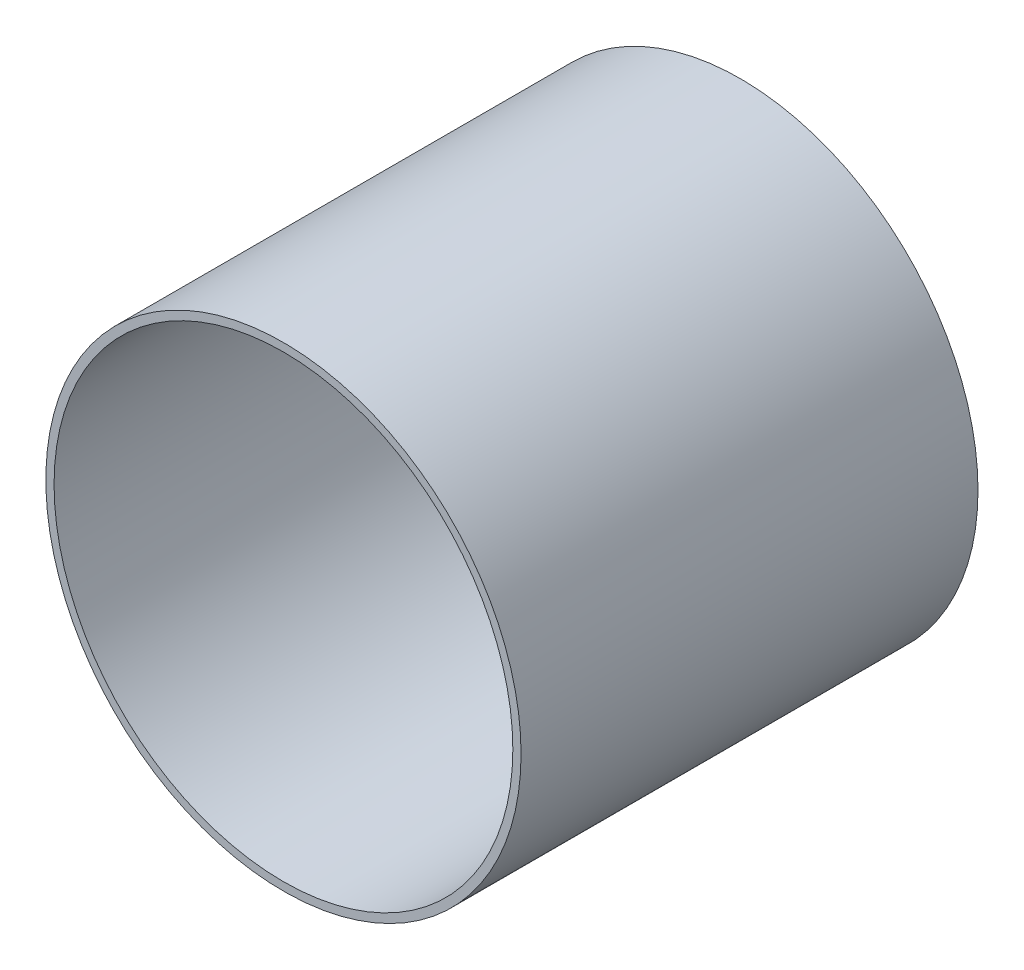
ISO-10303-21;
HEADER;
FILE_DESCRIPTION(('STEP AP214'),'2;1');
FILE_NAME('part.step','',(''),(''),'','','');
FILE_SCHEMA(('AUTOMOTIVE_DESIGN { 1 0 10303 214 1 1 1 1 }'));
ENDSEC;
DATA;
#1=APPLICATION_CONTEXT('core data for automotive mechanical design processes');
#2=APPLICATION_PROTOCOL_DEFINITION('international standard','automotive_design',2000,#1);
#3=PRODUCT_CONTEXT('',#1,'mechanical');
#4=PRODUCT('Part','Part','',(#3));
#5=PRODUCT_RELATED_PRODUCT_CATEGORY('part','',(#4));
#6=PRODUCT_DEFINITION_FORMATION('','',#4);
#7=PRODUCT_DEFINITION_CONTEXT('part definition',#1,'design');
#8=PRODUCT_DEFINITION('design','',#6,#7);
#9=PRODUCT_DEFINITION_SHAPE('','',#8);
#10=(LENGTH_UNIT() NAMED_UNIT(*) SI_UNIT(.MILLI.,.METRE.));
#11=(NAMED_UNIT(*) PLANE_ANGLE_UNIT() SI_UNIT($,.RADIAN.));
#12=(NAMED_UNIT(*) SI_UNIT($,.STERADIAN.) SOLID_ANGLE_UNIT());
#13=UNCERTAINTY_MEASURE_WITH_UNIT(LENGTH_MEASURE(1.E-05),#10,'distance_accuracy_value','');
#14=(GEOMETRIC_REPRESENTATION_CONTEXT(3) GLOBAL_UNCERTAINTY_ASSIGNED_CONTEXT((#13)) GLOBAL_UNIT_ASSIGNED_CONTEXT((#10,
#11,#12)) REPRESENTATION_CONTEXT('',''));
#15=CARTESIAN_POINT('',(0.,0.,0.));
#16=DIRECTION('',(0.,0.,1.));
#17=DIRECTION('',(1.,0.,0.));
#18=AXIS2_PLACEMENT_3D('',#15,#16,#17);
#19=CARTESIAN_POINT('',(0.,0.,25.));
#20=DIRECTION('',(0.,0.,1.));
#21=DIRECTION('',(1.,0.,0.));
#22=AXIS2_PLACEMENT_3D('',#19,#20,#21);
#23=PLANE('',#22);
#24=CARTESIAN_POINT('',(0.,0.,25.));
#25=DIRECTION('',(0.,0.,1.));
#26=DIRECTION('',(1.,0.,0.));
#27=AXIS2_PLACEMENT_3D('',#24,#25,#26);
#28=CIRCLE('',#27,13.);
#29=CARTESIAN_POINT('',(13.,0.,25.));
#30=VERTEX_POINT('',#29);
#31=EDGE_CURVE('E10',#30,#30,#28,.T.);
#32=ORIENTED_EDGE('',*,*,#31,.T.);
#33=EDGE_LOOP('',(#32));
#34=FACE_BOUND('',#33,.T.);
#35=CARTESIAN_POINT('',(0.,0.,25.));
#36=DIRECTION('',(0.,0.,1.));
#37=DIRECTION('',(1.,0.,0.));
#38=AXIS2_PLACEMENT_3D('',#35,#36,#37);
#39=CIRCLE('',#38,12.55);
#40=CARTESIAN_POINT('',(12.55,0.,25.));
#41=VERTEX_POINT('',#40);
#42=EDGE_CURVE('E42',#41,#41,#39,.T.);
#43=ORIENTED_EDGE('',*,*,#42,.F.);
#44=EDGE_LOOP('',(#43));
#45=FACE_BOUND('',#44,.T.);
#46=ADVANCED_FACE('F31',(#34,#45),#23,.T.);
#47=CARTESIAN_POINT('',(0.,0.,0.));
#48=DIRECTION('',(0.,0.,1.));
#49=DIRECTION('',(1.,0.,0.));
#50=AXIS2_PLACEMENT_3D('',#47,#48,#49);
#51=PLANE('',#50);
#52=CARTESIAN_POINT('',(0.,0.,0.));
#53=DIRECTION('',(0.,0.,1.));
#54=DIRECTION('',(1.,0.,0.));
#55=AXIS2_PLACEMENT_3D('',#52,#53,#54);
#56=CIRCLE('',#55,13.);
#57=CARTESIAN_POINT('',(13.,0.,0.));
#58=VERTEX_POINT('',#57);
#59=EDGE_CURVE('E35',#58,#58,#56,.T.);
#60=ORIENTED_EDGE('',*,*,#59,.F.);
#61=EDGE_LOOP('',(#60));
#62=FACE_BOUND('',#61,.T.);
#63=CARTESIAN_POINT('',(0.,0.,0.));
#64=DIRECTION('',(0.,0.,1.));
#65=DIRECTION('',(1.,0.,0.));
#66=AXIS2_PLACEMENT_3D('',#63,#64,#65);
#67=CIRCLE('',#66,12.55);
#68=CARTESIAN_POINT('',(12.55,0.,0.));
#69=VERTEX_POINT('',#68);
#70=EDGE_CURVE('E44',#69,#69,#67,.T.);
#71=ORIENTED_EDGE('',*,*,#70,.T.);
#72=EDGE_LOOP('',(#71));
#73=FACE_BOUND('',#72,.T.);
#74=ADVANCED_FACE('F54',(#62,#73),#51,.F.);
#75=CARTESIAN_POINT('',(0.,0.,25.));
#76=DIRECTION('',(0.,0.,-1.));
#77=DIRECTION('',(-1.,0.,0.));
#78=AXIS2_PLACEMENT_3D('',#75,#76,#77);
#79=CYLINDRICAL_SURFACE('',#78,13.);
#80=ORIENTED_EDGE('',*,*,#31,.F.);
#81=EDGE_LOOP('',(#80));
#82=FACE_BOUND('',#81,.T.);
#83=ORIENTED_EDGE('',*,*,#59,.T.);
#84=EDGE_LOOP('',(#83));
#85=FACE_BOUND('',#84,.T.);
#86=ADVANCED_FACE('F33',(#82,#85),#79,.T.);
#87=CARTESIAN_POINT('',(0.,0.,25.));
#88=DIRECTION('',(0.,0.,-1.));
#89=DIRECTION('',(-1.,0.,0.));
#90=AXIS2_PLACEMENT_3D('',#87,#88,#89);
#91=CYLINDRICAL_SURFACE('',#90,12.55);
#92=ORIENTED_EDGE('',*,*,#42,.T.);
#93=EDGE_LOOP('',(#92));
#94=FACE_BOUND('',#93,.T.);
#95=ORIENTED_EDGE('',*,*,#70,.F.);
#96=EDGE_LOOP('',(#95));
#97=FACE_BOUND('',#96,.T.);
#98=ADVANCED_FACE('F50',(#94,#97),#91,.F.);
#99=CLOSED_SHELL('',(#46,#74,#86,#98));
#100=MANIFOLD_SOLID_BREP('B2',#99);
#101=ADVANCED_BREP_SHAPE_REPRESENTATION('',(#18,#100),#14);
#102=SHAPE_DEFINITION_REPRESENTATION(#9,#101);
ENDSEC;
END-ISO-10303-21;
